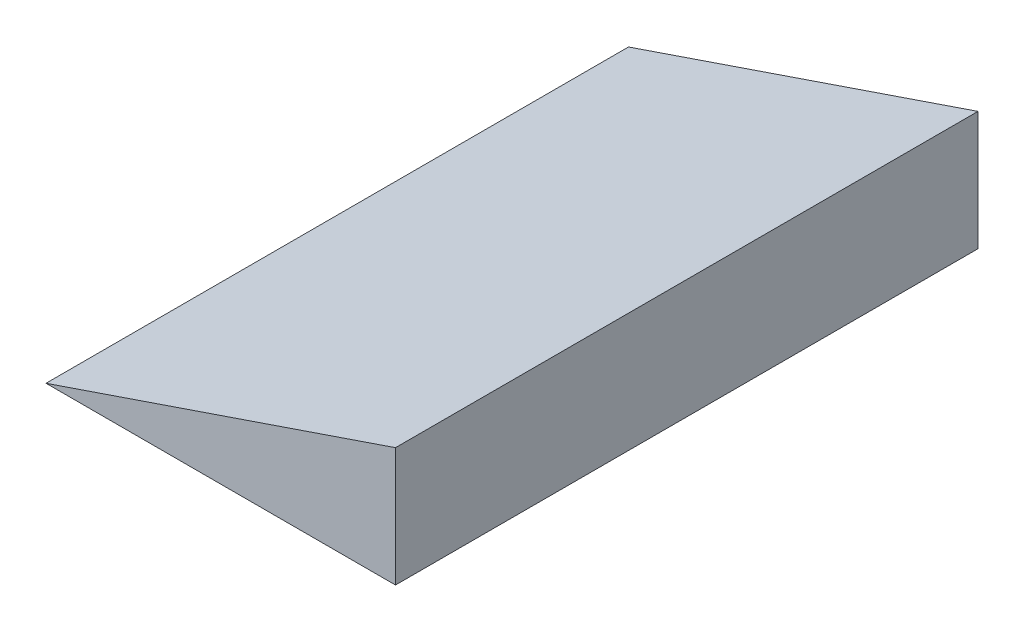
ISO-10303-21;
HEADER;
FILE_DESCRIPTION(('STEP AP214'),'2;1');
FILE_NAME('part.step','',(''),(''),'','','');
FILE_SCHEMA(('AUTOMOTIVE_DESIGN { 1 0 10303 214 1 1 1 1 }'));
ENDSEC;
DATA;
#1=APPLICATION_CONTEXT('core data for automotive mechanical design processes');
#2=APPLICATION_PROTOCOL_DEFINITION('international standard','automotive_design',2000,#1);
#3=PRODUCT_CONTEXT('',#1,'mechanical');
#4=PRODUCT('Part','Part','',(#3));
#5=PRODUCT_RELATED_PRODUCT_CATEGORY('part','',(#4));
#6=PRODUCT_DEFINITION_FORMATION('','',#4);
#7=PRODUCT_DEFINITION_CONTEXT('part definition',#1,'design');
#8=PRODUCT_DEFINITION('design','',#6,#7);
#9=PRODUCT_DEFINITION_SHAPE('','',#8);
#10=(LENGTH_UNIT() NAMED_UNIT(*) SI_UNIT(.MILLI.,.METRE.));
#11=(NAMED_UNIT(*) PLANE_ANGLE_UNIT() SI_UNIT($,.RADIAN.));
#12=(NAMED_UNIT(*) SI_UNIT($,.STERADIAN.) SOLID_ANGLE_UNIT());
#13=UNCERTAINTY_MEASURE_WITH_UNIT(LENGTH_MEASURE(1.E-05),#10,'distance_accuracy_value','');
#14=(GEOMETRIC_REPRESENTATION_CONTEXT(3) GLOBAL_UNCERTAINTY_ASSIGNED_CONTEXT((#13)) GLOBAL_UNIT_ASSIGNED_CONTEXT((#10,
#11,#12)) REPRESENTATION_CONTEXT('',''));
#15=CARTESIAN_POINT('',(0.,0.,0.));
#16=DIRECTION('',(0.,0.,1.));
#17=DIRECTION('',(1.,0.,0.));
#18=AXIS2_PLACEMENT_3D('',#15,#16,#17);
#19=CARTESIAN_POINT('',(30.,10.2128330568109,50.));
#20=DIRECTION('',(0.322265695230505,-0.946649260115698,0.));
#21=DIRECTION('',(0.946649260115698,0.322265695230505,0.));
#22=AXIS2_PLACEMENT_3D('',#19,#20,#21);
#23=PLANE('',#22);
#24=DIRECTION('',(-0.946649260115698,-0.322265695230505,0.));
#25=VECTOR('',#24,1.);
#26=CARTESIAN_POINT('',(30.,10.2128330568109,0.));
#27=LINE('',#26,#25);
#28=CARTESIAN_POINT('',(30.,10.2128330568109,0.));
#29=VERTEX_POINT('',#28);
#30=CARTESIAN_POINT('',(0.,0.,0.));
#31=VERTEX_POINT('',#30);
#32=EDGE_CURVE('E80',#29,#31,#27,.T.);
#33=ORIENTED_EDGE('',*,*,#32,.T.);
#34=DIRECTION('',(0.,0.,-1.));
#35=VECTOR('',#34,1.);
#36=CARTESIAN_POINT('',(0.,0.,50.));
#37=LINE('',#36,#35);
#38=CARTESIAN_POINT('',(0.,0.,50.));
#39=VERTEX_POINT('',#38);
#40=EDGE_CURVE('E11',#39,#31,#37,.T.);
#41=ORIENTED_EDGE('',*,*,#40,.F.);
#42=DIRECTION('',(-0.946649260115698,-0.322265695230505,0.));
#43=VECTOR('',#42,1.);
#44=CARTESIAN_POINT('',(30.,10.2128330568109,50.));
#45=LINE('',#44,#43);
#46=CARTESIAN_POINT('',(30.,10.2128330568109,50.));
#47=VERTEX_POINT('',#46);
#48=EDGE_CURVE('E73',#47,#39,#45,.T.);
#49=ORIENTED_EDGE('',*,*,#48,.F.);
#50=DIRECTION('',(0.,0.,-1.));
#51=VECTOR('',#50,1.);
#52=CARTESIAN_POINT('',(30.,10.2128330568109,50.));
#53=LINE('',#52,#51);
#54=EDGE_CURVE('E81',#47,#29,#53,.T.);
#55=ORIENTED_EDGE('',*,*,#54,.T.);
#56=EDGE_LOOP('',(#33,#41,#49,#55));
#57=FACE_BOUND('',#56,.T.);
#58=ADVANCED_FACE('F33',(#57),#23,.F.);
#59=CARTESIAN_POINT('',(0.,0.,50.));
#60=DIRECTION('',(0.,1.,0.));
#61=DIRECTION('',(0.,0.,1.));
#62=AXIS2_PLACEMENT_3D('',#59,#60,#61);
#63=PLANE('',#62);
#64=DIRECTION('',(1.,0.,0.));
#65=VECTOR('',#64,1.);
#66=CARTESIAN_POINT('',(0.,0.,0.));
#67=LINE('',#66,#65);
#68=CARTESIAN_POINT('',(30.,0.,0.));
#69=VERTEX_POINT('',#68);
#70=EDGE_CURVE('E61',#31,#69,#67,.T.);
#71=ORIENTED_EDGE('',*,*,#70,.T.);
#72=DIRECTION('',(0.,0.,-1.));
#73=VECTOR('',#72,1.);
#74=CARTESIAN_POINT('',(30.,0.,50.));
#75=LINE('',#74,#73);
#76=CARTESIAN_POINT('',(30.,0.,50.));
#77=VERTEX_POINT('',#76);
#78=EDGE_CURVE('E41',#77,#69,#75,.T.);
#79=ORIENTED_EDGE('',*,*,#78,.F.);
#80=DIRECTION('',(1.,0.,0.));
#81=VECTOR('',#80,1.);
#82=CARTESIAN_POINT('',(0.,0.,50.));
#83=LINE('',#82,#81);
#84=EDGE_CURVE('E69',#39,#77,#83,.T.);
#85=ORIENTED_EDGE('',*,*,#84,.F.);
#86=ORIENTED_EDGE('',*,*,#40,.T.);
#87=EDGE_LOOP('',(#71,#79,#85,#86));
#88=FACE_BOUND('',#87,.T.);
#89=ADVANCED_FACE('F70',(#88),#63,.F.);
#90=CARTESIAN_POINT('',(30.,0.,50.));
#91=DIRECTION('',(-1.,0.,0.));
#92=DIRECTION('',(0.,0.,1.));
#93=AXIS2_PLACEMENT_3D('',#90,#91,#92);
#94=PLANE('',#93);
#95=DIRECTION('',(0.,1.,0.));
#96=VECTOR('',#95,1.);
#97=CARTESIAN_POINT('',(30.,0.,0.));
#98=LINE('',#97,#96);
#99=EDGE_CURVE('E66',#69,#29,#98,.T.);
#100=ORIENTED_EDGE('',*,*,#99,.T.);
#101=ORIENTED_EDGE('',*,*,#54,.F.);
#102=DIRECTION('',(0.,1.,0.));
#103=VECTOR('',#102,1.);
#104=CARTESIAN_POINT('',(30.,0.,50.));
#105=LINE('',#104,#103);
#106=EDGE_CURVE('E49',#77,#47,#105,.T.);
#107=ORIENTED_EDGE('',*,*,#106,.F.);
#108=ORIENTED_EDGE('',*,*,#78,.T.);
#109=EDGE_LOOP('',(#100,#101,#107,#108));
#110=FACE_BOUND('',#109,.T.);
#111=ADVANCED_FACE('F88',(#110),#94,.F.);
#112=CARTESIAN_POINT('',(0.,0.,50.));
#113=DIRECTION('',(0.,0.,-1.));
#114=DIRECTION('',(-1.,0.,0.));
#115=AXIS2_PLACEMENT_3D('',#112,#113,#114);
#116=PLANE('',#115);
#117=ORIENTED_EDGE('',*,*,#48,.T.);
#118=ORIENTED_EDGE('',*,*,#84,.T.);
#119=ORIENTED_EDGE('',*,*,#106,.T.);
#120=EDGE_LOOP('',(#117,#118,#119));
#121=FACE_BOUND('',#120,.T.);
#122=ADVANCED_FACE('F76',(#121),#116,.F.);
#123=CARTESIAN_POINT('',(0.,0.,0.));
#124=DIRECTION('',(0.,0.,-1.));
#125=DIRECTION('',(-1.,0.,0.));
#126=AXIS2_PLACEMENT_3D('',#123,#124,#125);
#127=PLANE('',#126);
#128=ORIENTED_EDGE('',*,*,#32,.F.);
#129=ORIENTED_EDGE('',*,*,#99,.F.);
#130=ORIENTED_EDGE('',*,*,#70,.F.);
#131=EDGE_LOOP('',(#128,#129,#130));
#132=FACE_BOUND('',#131,.T.);
#133=ADVANCED_FACE('F89',(#132),#127,.T.);
#134=CLOSED_SHELL('',(#58,#89,#111,#122,#133));
#135=MANIFOLD_SOLID_BREP('B2',#134);
#136=ADVANCED_BREP_SHAPE_REPRESENTATION('',(#18,#135),#14);
#137=SHAPE_DEFINITION_REPRESENTATION(#9,#136);
ENDSEC;
END-ISO-10303-21;
